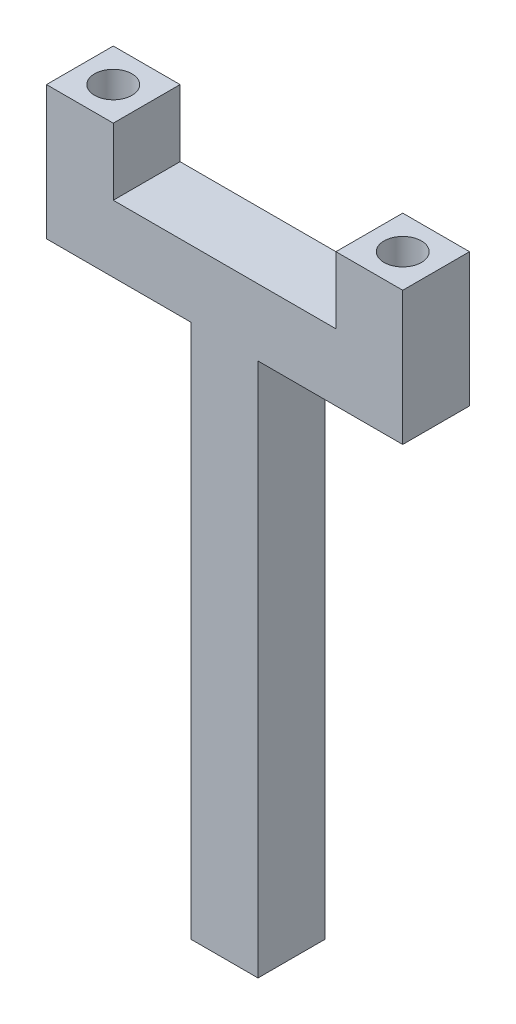
ISO-10303-21;
HEADER;
FILE_DESCRIPTION(('STEP AP214'),'2;1');
FILE_NAME('part.step','',(''),(''),'','','');
FILE_SCHEMA(('AUTOMOTIVE_DESIGN { 1 0 10303 214 1 1 1 1 }'));
ENDSEC;
DATA;
#1=APPLICATION_CONTEXT('core data for automotive mechanical design processes');
#2=APPLICATION_PROTOCOL_DEFINITION('international standard','automotive_design',2000,#1);
#3=PRODUCT_CONTEXT('',#1,'mechanical');
#4=PRODUCT('Part','Part','',(#3));
#5=PRODUCT_RELATED_PRODUCT_CATEGORY('part','',(#4));
#6=PRODUCT_DEFINITION_FORMATION('','',#4);
#7=PRODUCT_DEFINITION_CONTEXT('part definition',#1,'design');
#8=PRODUCT_DEFINITION('design','',#6,#7);
#9=PRODUCT_DEFINITION_SHAPE('','',#8);
#10=(LENGTH_UNIT() NAMED_UNIT(*) SI_UNIT(.MILLI.,.METRE.));
#11=(NAMED_UNIT(*) PLANE_ANGLE_UNIT() SI_UNIT($,.RADIAN.));
#12=(NAMED_UNIT(*) SI_UNIT($,.STERADIAN.) SOLID_ANGLE_UNIT());
#13=UNCERTAINTY_MEASURE_WITH_UNIT(LENGTH_MEASURE(1.E-05),#10,'distance_accuracy_value','');
#14=(GEOMETRIC_REPRESENTATION_CONTEXT(3) GLOBAL_UNCERTAINTY_ASSIGNED_CONTEXT((#13)) GLOBAL_UNIT_ASSIGNED_CONTEXT((#10,
#11,#12)) REPRESENTATION_CONTEXT('',''));
#15=CARTESIAN_POINT('',(0.,0.,0.));
#16=DIRECTION('',(0.,0.,1.));
#17=DIRECTION('',(1.,0.,0.));
#18=AXIS2_PLACEMENT_3D('',#15,#16,#17);
#19=CARTESIAN_POINT('',(12.5,75.,7.5));
#20=DIRECTION('',(1.,0.,0.));
#21=DIRECTION('',(0.,0.,-1.));
#22=AXIS2_PLACEMENT_3D('',#19,#20,#21);
#23=PLANE('',#22);
#24=DIRECTION('',(0.,-1.,0.));
#25=VECTOR('',#24,1.);
#26=CARTESIAN_POINT('',(12.5,75.,0.));
#27=LINE('',#26,#25);
#28=CARTESIAN_POINT('',(12.5,75.,0.));
#29=VERTEX_POINT('',#28);
#30=CARTESIAN_POINT('',(12.5,67.5,0.));
#31=VERTEX_POINT('',#30);
#32=EDGE_CURVE('E153',#29,#31,#27,.T.);
#33=ORIENTED_EDGE('',*,*,#32,.T.);
#34=DIRECTION('',(0.,0.,-1.));
#35=VECTOR('',#34,1.);
#36=CARTESIAN_POINT('',(12.5,67.5,7.5));
#37=LINE('',#36,#35);
#38=CARTESIAN_POINT('',(12.5,67.5,7.5));
#39=VERTEX_POINT('',#38);
#40=EDGE_CURVE('E11',#39,#31,#37,.T.);
#41=ORIENTED_EDGE('',*,*,#40,.F.);
#42=DIRECTION('',(0.,-1.,0.));
#43=VECTOR('',#42,1.);
#44=CARTESIAN_POINT('',(12.5,75.,7.5));
#45=LINE('',#44,#43);
#46=CARTESIAN_POINT('',(12.5,75.,7.5));
#47=VERTEX_POINT('',#46);
#48=EDGE_CURVE('E176',#47,#39,#45,.T.);
#49=ORIENTED_EDGE('',*,*,#48,.F.);
#50=DIRECTION('',(0.,0.,-1.));
#51=VECTOR('',#50,1.);
#52=CARTESIAN_POINT('',(12.5,75.,7.5));
#53=LINE('',#52,#51);
#54=EDGE_CURVE('E149',#47,#29,#53,.T.);
#55=ORIENTED_EDGE('',*,*,#54,.T.);
#56=EDGE_LOOP('',(#33,#41,#49,#55));
#57=FACE_BOUND('',#56,.T.);
#58=ADVANCED_FACE('F33',(#57),#23,.F.);
#59=CARTESIAN_POINT('',(0.,67.5,7.5));
#60=DIRECTION('',(0.,-1.,0.));
#61=DIRECTION('',(0.,0.,-1.));
#62=AXIS2_PLACEMENT_3D('',#59,#60,#61);
#63=PLANE('',#62);
#64=DIRECTION('',(-1.,0.,0.));
#65=VECTOR('',#64,1.);
#66=CARTESIAN_POINT('',(0.,67.5,0.));
#67=LINE('',#66,#65);
#68=CARTESIAN_POINT('',(-12.5,67.5,0.));
#69=VERTEX_POINT('',#68);
#70=EDGE_CURVE('E156',#31,#69,#67,.T.);
#71=ORIENTED_EDGE('',*,*,#70,.T.);
#72=DIRECTION('',(0.,0.,-1.));
#73=VECTOR('',#72,1.);
#74=CARTESIAN_POINT('',(-12.5,67.5,7.5));
#75=LINE('',#74,#73);
#76=CARTESIAN_POINT('',(-12.5,67.5,7.5));
#77=VERTEX_POINT('',#76);
#78=EDGE_CURVE('E41',#77,#69,#75,.T.);
#79=ORIENTED_EDGE('',*,*,#78,.F.);
#80=DIRECTION('',(-1.,0.,0.));
#81=VECTOR('',#80,1.);
#82=CARTESIAN_POINT('',(12.5,67.5,7.5));
#83=LINE('',#82,#81);
#84=EDGE_CURVE('E104',#39,#77,#83,.T.);
#85=ORIENTED_EDGE('',*,*,#84,.F.);
#86=ORIENTED_EDGE('',*,*,#40,.T.);
#87=EDGE_LOOP('',(#71,#79,#85,#86));
#88=FACE_BOUND('',#87,.T.);
#89=ADVANCED_FACE('F256',(#88),#63,.F.);
#90=CARTESIAN_POINT('',(-12.5,67.5,7.5));
#91=DIRECTION('',(-1.,0.,0.));
#92=DIRECTION('',(0.,0.,1.));
#93=AXIS2_PLACEMENT_3D('',#90,#91,#92);
#94=PLANE('',#93);
#95=DIRECTION('',(0.,1.,0.));
#96=VECTOR('',#95,1.);
#97=CARTESIAN_POINT('',(-12.5,67.5,0.));
#98=LINE('',#97,#96);
#99=CARTESIAN_POINT('',(-12.5,75.,0.));
#100=VERTEX_POINT('',#99);
#101=EDGE_CURVE('E159',#69,#100,#98,.T.);
#102=ORIENTED_EDGE('',*,*,#101,.T.);
#103=DIRECTION('',(0.,0.,-1.));
#104=VECTOR('',#103,1.);
#105=CARTESIAN_POINT('',(-12.5,75.,7.5));
#106=LINE('',#105,#104);
#107=CARTESIAN_POINT('',(-12.5,75.,7.5));
#108=VERTEX_POINT('',#107);
#109=EDGE_CURVE('E195',#108,#100,#106,.T.);
#110=ORIENTED_EDGE('',*,*,#109,.F.);
#111=DIRECTION('',(0.,1.,0.));
#112=VECTOR('',#111,1.);
#113=CARTESIAN_POINT('',(-12.5,67.5,7.5));
#114=LINE('',#113,#112);
#115=EDGE_CURVE('E203',#77,#108,#114,.T.);
#116=ORIENTED_EDGE('',*,*,#115,.F.);
#117=ORIENTED_EDGE('',*,*,#78,.T.);
#118=EDGE_LOOP('',(#102,#110,#116,#117));
#119=FACE_BOUND('',#118,.T.);
#120=ADVANCED_FACE('F201',(#119),#94,.F.);
#121=CARTESIAN_POINT('',(-12.5,75.,7.5));
#122=DIRECTION('',(0.,-1.,0.));
#123=DIRECTION('',(0.,0.,-1.));
#124=AXIS2_PLACEMENT_3D('',#121,#122,#123);
#125=PLANE('',#124);
#126=CARTESIAN_POINT('',(-16.25,75.,3.75));
#127=DIRECTION('',(0.,1.,0.));
#128=DIRECTION('',(0.,0.,1.));
#129=AXIS2_PLACEMENT_3D('',#126,#127,#128);
#130=CIRCLE('',#129,2.1);
#131=CARTESIAN_POINT('',(-16.25,75.,5.85));
#132=VERTEX_POINT('',#131);
#133=EDGE_CURVE('E362',#132,#132,#130,.T.);
#134=ORIENTED_EDGE('',*,*,#133,.F.);
#135=EDGE_LOOP('',(#134));
#136=FACE_BOUND('',#135,.T.);
#137=DIRECTION('',(-1.,0.,0.));
#138=VECTOR('',#137,1.);
#139=CARTESIAN_POINT('',(-12.5,75.,0.));
#140=LINE('',#139,#138);
#141=CARTESIAN_POINT('',(-20.,75.,0.));
#142=VERTEX_POINT('',#141);
#143=EDGE_CURVE('E161',#100,#142,#140,.T.);
#144=ORIENTED_EDGE('',*,*,#143,.T.);
#145=DIRECTION('',(0.,0.,-1.));
#146=VECTOR('',#145,1.);
#147=CARTESIAN_POINT('',(-20.,75.,7.5));
#148=LINE('',#147,#146);
#149=CARTESIAN_POINT('',(-20.,75.,7.5));
#150=VERTEX_POINT('',#149);
#151=EDGE_CURVE('E192',#150,#142,#148,.T.);
#152=ORIENTED_EDGE('',*,*,#151,.F.);
#153=DIRECTION('',(-1.,0.,0.));
#154=VECTOR('',#153,1.);
#155=CARTESIAN_POINT('',(-12.5,75.,7.5));
#156=LINE('',#155,#154);
#157=EDGE_CURVE('E221',#108,#150,#156,.T.);
#158=ORIENTED_EDGE('',*,*,#157,.F.);
#159=ORIENTED_EDGE('',*,*,#109,.T.);
#160=EDGE_LOOP('',(#144,#152,#158,#159));
#161=FACE_BOUND('',#160,.T.);
#162=ADVANCED_FACE('F212',(#136,#161),#125,.F.);
#163=CARTESIAN_POINT('',(-20.,75.,7.5));
#164=DIRECTION('',(1.,0.,0.));
#165=DIRECTION('',(0.,0.,-1.));
#166=AXIS2_PLACEMENT_3D('',#163,#164,#165);
#167=PLANE('',#166);
#168=DIRECTION('',(0.,-1.,0.));
#169=VECTOR('',#168,1.);
#170=CARTESIAN_POINT('',(-20.,75.,0.));
#171=LINE('',#170,#169);
#172=CARTESIAN_POINT('',(-20.,60.,0.));
#173=VERTEX_POINT('',#172);
#174=EDGE_CURVE('E163',#142,#173,#171,.T.);
#175=ORIENTED_EDGE('',*,*,#174,.T.);
#176=DIRECTION('',(0.,0.,-1.));
#177=VECTOR('',#176,1.);
#178=CARTESIAN_POINT('',(-20.,60.,7.5));
#179=LINE('',#178,#177);
#180=CARTESIAN_POINT('',(-20.,60.,7.5));
#181=VERTEX_POINT('',#180);
#182=EDGE_CURVE('E189',#181,#173,#179,.T.);
#183=ORIENTED_EDGE('',*,*,#182,.F.);
#184=DIRECTION('',(0.,-1.,0.));
#185=VECTOR('',#184,1.);
#186=CARTESIAN_POINT('',(-20.,75.,7.5));
#187=LINE('',#186,#185);
#188=EDGE_CURVE('E218',#150,#181,#187,.T.);
#189=ORIENTED_EDGE('',*,*,#188,.F.);
#190=ORIENTED_EDGE('',*,*,#151,.T.);
#191=EDGE_LOOP('',(#175,#183,#189,#190));
#192=FACE_BOUND('',#191,.T.);
#193=ADVANCED_FACE('F216',(#192),#167,.F.);
#194=CARTESIAN_POINT('',(-20.,60.,7.5));
#195=DIRECTION('',(0.,1.,0.));
#196=DIRECTION('',(-1.,0.,0.));
#197=AXIS2_PLACEMENT_3D('',#194,#195,#196);
#198=PLANE('',#197);
#199=DIRECTION('',(1.,0.,0.));
#200=VECTOR('',#199,1.);
#201=CARTESIAN_POINT('',(-20.,60.,0.));
#202=LINE('',#201,#200);
#203=CARTESIAN_POINT('',(-3.75,60.,0.));
#204=VERTEX_POINT('',#203);
#205=EDGE_CURVE('E165',#173,#204,#202,.T.);
#206=ORIENTED_EDGE('',*,*,#205,.T.);
#207=DIRECTION('',(0.,0.,-1.));
#208=VECTOR('',#207,1.);
#209=CARTESIAN_POINT('',(-3.75,60.,7.5));
#210=LINE('',#209,#208);
#211=CARTESIAN_POINT('',(-3.75,60.,7.5));
#212=VERTEX_POINT('',#211);
#213=EDGE_CURVE('E186',#212,#204,#210,.T.);
#214=ORIENTED_EDGE('',*,*,#213,.F.);
#215=DIRECTION('',(1.,0.,0.));
#216=VECTOR('',#215,1.);
#217=CARTESIAN_POINT('',(-20.,60.,7.5));
#218=LINE('',#217,#216);
#219=EDGE_CURVE('E220',#181,#212,#218,.T.);
#220=ORIENTED_EDGE('',*,*,#219,.F.);
#221=ORIENTED_EDGE('',*,*,#182,.T.);
#222=EDGE_LOOP('',(#206,#214,#220,#221));
#223=FACE_BOUND('',#222,.T.);
#224=ADVANCED_FACE('F270',(#223),#198,.F.);
#225=CARTESIAN_POINT('',(-3.75,60.,7.5));
#226=DIRECTION('',(1.,0.,0.));
#227=DIRECTION('',(0.,0.,-1.));
#228=AXIS2_PLACEMENT_3D('',#225,#226,#227);
#229=PLANE('',#228);
#230=DIRECTION('',(0.,-1.,0.));
#231=VECTOR('',#230,1.);
#232=CARTESIAN_POINT('',(-3.75,60.,0.));
#233=LINE('',#232,#231);
#234=CARTESIAN_POINT('',(-3.75,0.,0.));
#235=VERTEX_POINT('',#234);
#236=EDGE_CURVE('E167',#204,#235,#233,.T.);
#237=ORIENTED_EDGE('',*,*,#236,.T.);
#238=DIRECTION('',(0.,0.,-1.));
#239=VECTOR('',#238,1.);
#240=CARTESIAN_POINT('',(-3.75,0.,7.5));
#241=LINE('',#240,#239);
#242=CARTESIAN_POINT('',(-3.75,0.,7.5));
#243=VERTEX_POINT('',#242);
#244=EDGE_CURVE('E183',#243,#235,#241,.T.);
#245=ORIENTED_EDGE('',*,*,#244,.F.);
#246=DIRECTION('',(0.,-1.,0.));
#247=VECTOR('',#246,1.);
#248=CARTESIAN_POINT('',(-3.75,60.,7.5));
#249=LINE('',#248,#247);
#250=EDGE_CURVE('E223',#212,#243,#249,.T.);
#251=ORIENTED_EDGE('',*,*,#250,.F.);
#252=ORIENTED_EDGE('',*,*,#213,.T.);
#253=EDGE_LOOP('',(#237,#245,#251,#252));
#254=FACE_BOUND('',#253,.T.);
#255=ADVANCED_FACE('F273',(#254),#229,.F.);
#256=CARTESIAN_POINT('',(3.75,0.,7.5));
#257=DIRECTION('',(0.,1.,0.));
#258=DIRECTION('',(0.,0.,1.));
#259=AXIS2_PLACEMENT_3D('',#256,#257,#258);
#260=PLANE('',#259);
#261=DIRECTION('',(1.,0.,0.));
#262=VECTOR('',#261,1.);
#263=CARTESIAN_POINT('',(3.75,0.,0.));
#264=LINE('',#263,#262);
#265=CARTESIAN_POINT('',(3.75,0.,0.));
#266=VERTEX_POINT('',#265);
#267=EDGE_CURVE('E169',#235,#266,#264,.T.);
#268=ORIENTED_EDGE('',*,*,#267,.T.);
#269=DIRECTION('',(0.,0.,-1.));
#270=VECTOR('',#269,1.);
#271=CARTESIAN_POINT('',(3.75,0.,7.5));
#272=LINE('',#271,#270);
#273=CARTESIAN_POINT('',(3.75,0.,7.5));
#274=VERTEX_POINT('',#273);
#275=EDGE_CURVE('E180',#274,#266,#272,.T.);
#276=ORIENTED_EDGE('',*,*,#275,.F.);
#277=DIRECTION('',(1.,0.,0.));
#278=VECTOR('',#277,1.);
#279=CARTESIAN_POINT('',(3.75,0.,7.5));
#280=LINE('',#279,#278);
#281=EDGE_CURVE('E229',#243,#274,#280,.T.);
#282=ORIENTED_EDGE('',*,*,#281,.F.);
#283=ORIENTED_EDGE('',*,*,#244,.T.);
#284=EDGE_LOOP('',(#268,#276,#282,#283));
#285=FACE_BOUND('',#284,.T.);
#286=ADVANCED_FACE('F235',(#285),#260,.F.);
#287=CARTESIAN_POINT('',(3.75,60.,7.5));
#288=DIRECTION('',(-1.,0.,0.));
#289=DIRECTION('',(0.,0.,1.));
#290=AXIS2_PLACEMENT_3D('',#287,#288,#289);
#291=PLANE('',#290);
#292=DIRECTION('',(0.,1.,0.));
#293=VECTOR('',#292,1.);
#294=CARTESIAN_POINT('',(3.75,60.,0.));
#295=LINE('',#294,#293);
#296=CARTESIAN_POINT('',(3.75,60.,0.));
#297=VERTEX_POINT('',#296);
#298=EDGE_CURVE('E171',#266,#297,#295,.T.);
#299=ORIENTED_EDGE('',*,*,#298,.T.);
#300=DIRECTION('',(0.,0.,-1.));
#301=VECTOR('',#300,1.);
#302=CARTESIAN_POINT('',(3.75,60.,7.5));
#303=LINE('',#302,#301);
#304=CARTESIAN_POINT('',(3.75,60.,7.5));
#305=VERTEX_POINT('',#304);
#306=EDGE_CURVE('E144',#305,#297,#303,.T.);
#307=ORIENTED_EDGE('',*,*,#306,.F.);
#308=DIRECTION('',(0.,1.,0.));
#309=VECTOR('',#308,1.);
#310=CARTESIAN_POINT('',(3.75,60.,7.5));
#311=LINE('',#310,#309);
#312=EDGE_CURVE('E135',#274,#305,#311,.T.);
#313=ORIENTED_EDGE('',*,*,#312,.F.);
#314=ORIENTED_EDGE('',*,*,#275,.T.);
#315=EDGE_LOOP('',(#299,#307,#313,#314));
#316=FACE_BOUND('',#315,.T.);
#317=ADVANCED_FACE('F239',(#316),#291,.F.);
#318=CARTESIAN_POINT('',(20.,60.,7.5));
#319=DIRECTION('',(0.,1.,0.));
#320=DIRECTION('',(-1.,0.,0.));
#321=AXIS2_PLACEMENT_3D('',#318,#319,#320);
#322=PLANE('',#321);
#323=DIRECTION('',(1.,0.,0.));
#324=VECTOR('',#323,1.);
#325=CARTESIAN_POINT('',(20.,60.,0.));
#326=LINE('',#325,#324);
#327=CARTESIAN_POINT('',(20.,60.,0.));
#328=VERTEX_POINT('',#327);
#329=EDGE_CURVE('E143',#297,#328,#326,.T.);
#330=ORIENTED_EDGE('',*,*,#329,.T.);
#331=DIRECTION('',(0.,0.,-1.));
#332=VECTOR('',#331,1.);
#333=CARTESIAN_POINT('',(20.,60.,7.5));
#334=LINE('',#333,#332);
#335=CARTESIAN_POINT('',(20.,60.,7.5));
#336=VERTEX_POINT('',#335);
#337=EDGE_CURVE('E140',#336,#328,#334,.T.);
#338=ORIENTED_EDGE('',*,*,#337,.F.);
#339=DIRECTION('',(1.,0.,0.));
#340=VECTOR('',#339,1.);
#341=CARTESIAN_POINT('',(20.,60.,7.5));
#342=LINE('',#341,#340);
#343=EDGE_CURVE('E129',#305,#336,#342,.T.);
#344=ORIENTED_EDGE('',*,*,#343,.F.);
#345=ORIENTED_EDGE('',*,*,#306,.T.);
#346=EDGE_LOOP('',(#330,#338,#344,#345));
#347=FACE_BOUND('',#346,.T.);
#348=ADVANCED_FACE('F141',(#347),#322,.F.);
#349=CARTESIAN_POINT('',(20.,75.,7.5));
#350=DIRECTION('',(-1.,0.,0.));
#351=DIRECTION('',(0.,-1.,0.));
#352=AXIS2_PLACEMENT_3D('',#349,#350,#351);
#353=PLANE('',#352);
#354=DIRECTION('',(0.,1.,0.));
#355=VECTOR('',#354,1.);
#356=CARTESIAN_POINT('',(20.,75.,0.));
#357=LINE('',#356,#355);
#358=CARTESIAN_POINT('',(20.,75.,0.));
#359=VERTEX_POINT('',#358);
#360=EDGE_CURVE('E90',#328,#359,#357,.T.);
#361=ORIENTED_EDGE('',*,*,#360,.T.);
#362=DIRECTION('',(0.,0.,-1.));
#363=VECTOR('',#362,1.);
#364=CARTESIAN_POINT('',(20.,75.,7.5));
#365=LINE('',#364,#363);
#366=CARTESIAN_POINT('',(20.,75.,7.5));
#367=VERTEX_POINT('',#366);
#368=EDGE_CURVE('E145',#367,#359,#365,.T.);
#369=ORIENTED_EDGE('',*,*,#368,.F.);
#370=DIRECTION('',(0.,1.,0.));
#371=VECTOR('',#370,1.);
#372=CARTESIAN_POINT('',(20.,75.,7.5));
#373=LINE('',#372,#371);
#374=EDGE_CURVE('E133',#336,#367,#373,.T.);
#375=ORIENTED_EDGE('',*,*,#374,.F.);
#376=ORIENTED_EDGE('',*,*,#337,.T.);
#377=EDGE_LOOP('',(#361,#369,#375,#376));
#378=FACE_BOUND('',#377,.T.);
#379=ADVANCED_FACE('F147',(#378),#353,.F.);
#380=CARTESIAN_POINT('',(12.5,75.,7.5));
#381=DIRECTION('',(0.,-1.,0.));
#382=DIRECTION('',(0.,0.,-1.));
#383=AXIS2_PLACEMENT_3D('',#380,#381,#382);
#384=PLANE('',#383);
#385=CARTESIAN_POINT('',(16.25,75.,3.75));
#386=DIRECTION('',(0.,1.,0.));
#387=DIRECTION('',(0.,0.,1.));
#388=AXIS2_PLACEMENT_3D('',#385,#386,#387);
#389=CIRCLE('',#388,2.1);
#390=CARTESIAN_POINT('',(16.25,75.,5.85));
#391=VERTEX_POINT('',#390);
#392=EDGE_CURVE('E370',#391,#391,#389,.T.);
#393=ORIENTED_EDGE('',*,*,#392,.F.);
#394=EDGE_LOOP('',(#393));
#395=FACE_BOUND('',#394,.T.);
#396=DIRECTION('',(-1.,0.,0.));
#397=VECTOR('',#396,1.);
#398=CARTESIAN_POINT('',(12.5,75.,0.));
#399=LINE('',#398,#397);
#400=EDGE_CURVE('E96',#359,#29,#399,.T.);
#401=ORIENTED_EDGE('',*,*,#400,.T.);
#402=ORIENTED_EDGE('',*,*,#54,.F.);
#403=DIRECTION('',(-1.,0.,0.));
#404=VECTOR('',#403,1.);
#405=CARTESIAN_POINT('',(12.5,75.,7.5));
#406=LINE('',#405,#404);
#407=EDGE_CURVE('E49',#367,#47,#406,.T.);
#408=ORIENTED_EDGE('',*,*,#407,.F.);
#409=ORIENTED_EDGE('',*,*,#368,.T.);
#410=EDGE_LOOP('',(#401,#402,#408,#409));
#411=FACE_BOUND('',#410,.T.);
#412=ADVANCED_FACE('F243',(#395,#411),#384,.F.);
#413=CARTESIAN_POINT('',(0.,0.,7.5));
#414=DIRECTION('',(0.,0.,-1.));
#415=DIRECTION('',(-1.,0.,0.));
#416=AXIS2_PLACEMENT_3D('',#413,#414,#415);
#417=PLANE('',#416);
#418=ORIENTED_EDGE('',*,*,#48,.T.);
#419=ORIENTED_EDGE('',*,*,#84,.T.);
#420=ORIENTED_EDGE('',*,*,#115,.T.);
#421=ORIENTED_EDGE('',*,*,#157,.T.);
#422=ORIENTED_EDGE('',*,*,#188,.T.);
#423=ORIENTED_EDGE('',*,*,#219,.T.);
#424=ORIENTED_EDGE('',*,*,#250,.T.);
#425=ORIENTED_EDGE('',*,*,#281,.T.);
#426=ORIENTED_EDGE('',*,*,#312,.T.);
#427=ORIENTED_EDGE('',*,*,#343,.T.);
#428=ORIENTED_EDGE('',*,*,#374,.T.);
#429=ORIENTED_EDGE('',*,*,#407,.T.);
#430=EDGE_LOOP('',(#418,#419,#420,#421,#422,#423,#424,#425,#426,#427,#428,#429));
#431=FACE_BOUND('',#430,.T.);
#432=ADVANCED_FACE('F131',(#431),#417,.F.);
#433=CARTESIAN_POINT('',(0.,0.,0.));
#434=DIRECTION('',(0.,0.,-1.));
#435=DIRECTION('',(-1.,0.,0.));
#436=AXIS2_PLACEMENT_3D('',#433,#434,#435);
#437=PLANE('',#436);
#438=ORIENTED_EDGE('',*,*,#32,.F.);
#439=ORIENTED_EDGE('',*,*,#400,.F.);
#440=ORIENTED_EDGE('',*,*,#360,.F.);
#441=ORIENTED_EDGE('',*,*,#329,.F.);
#442=ORIENTED_EDGE('',*,*,#298,.F.);
#443=ORIENTED_EDGE('',*,*,#267,.F.);
#444=ORIENTED_EDGE('',*,*,#236,.F.);
#445=ORIENTED_EDGE('',*,*,#205,.F.);
#446=ORIENTED_EDGE('',*,*,#174,.F.);
#447=ORIENTED_EDGE('',*,*,#143,.F.);
#448=ORIENTED_EDGE('',*,*,#101,.F.);
#449=ORIENTED_EDGE('',*,*,#70,.F.);
#450=EDGE_LOOP('',(#438,#439,#440,#441,#442,#443,#444,#445,#446,#447,#448,#449));
#451=FACE_BOUND('',#450,.T.);
#452=ADVANCED_FACE('F207',(#451),#437,.T.);
#453=CARTESIAN_POINT('',(16.25,70.,3.75));
#454=DIRECTION('',(0.,1.,0.));
#455=DIRECTION('',(0.,0.,1.));
#456=AXIS2_PLACEMENT_3D('',#453,#454,#455);
#457=CYLINDRICAL_SURFACE('',#456,2.1);
#458=CARTESIAN_POINT('',(16.25,70.,3.75));
#459=DIRECTION('',(0.,1.,0.));
#460=DIRECTION('',(0.,0.,1.));
#461=AXIS2_PLACEMENT_3D('',#458,#459,#460);
#462=CIRCLE('',#461,2.1);
#463=CARTESIAN_POINT('',(16.25,70.,5.85));
#464=VERTEX_POINT('',#463);
#465=EDGE_CURVE('E365',#464,#464,#462,.T.);
#466=ORIENTED_EDGE('',*,*,#465,.F.);
#467=EDGE_LOOP('',(#466));
#468=FACE_BOUND('',#467,.T.);
#469=ORIENTED_EDGE('',*,*,#392,.T.);
#470=EDGE_LOOP('',(#469));
#471=FACE_BOUND('',#470,.T.);
#472=ADVANCED_FACE('F307',(#468,#471),#457,.F.);
#473=CARTESIAN_POINT('',(16.25,70.,3.75));
#474=DIRECTION('',(0.,1.,0.));
#475=DIRECTION('',(0.,0.,1.));
#476=AXIS2_PLACEMENT_3D('',#473,#474,#475);
#477=PLANE('',#476);
#478=ORIENTED_EDGE('',*,*,#465,.T.);
#479=EDGE_LOOP('',(#478));
#480=FACE_BOUND('',#479,.T.);
#481=ADVANCED_FACE('F326',(#480),#477,.T.);
#482=CARTESIAN_POINT('',(-16.25,70.,3.75));
#483=DIRECTION('',(0.,1.,0.));
#484=DIRECTION('',(0.,0.,1.));
#485=AXIS2_PLACEMENT_3D('',#482,#483,#484);
#486=CYLINDRICAL_SURFACE('',#485,2.1);
#487=CARTESIAN_POINT('',(-16.25,70.,3.75));
#488=DIRECTION('',(0.,1.,0.));
#489=DIRECTION('',(0.,0.,1.));
#490=AXIS2_PLACEMENT_3D('',#487,#488,#489);
#491=CIRCLE('',#490,2.1);
#492=CARTESIAN_POINT('',(-16.25,70.,5.85));
#493=VERTEX_POINT('',#492);
#494=EDGE_CURVE('E157',#493,#493,#491,.T.);
#495=ORIENTED_EDGE('',*,*,#494,.F.);
#496=EDGE_LOOP('',(#495));
#497=FACE_BOUND('',#496,.T.);
#498=ORIENTED_EDGE('',*,*,#133,.T.);
#499=EDGE_LOOP('',(#498));
#500=FACE_BOUND('',#499,.T.);
#501=ADVANCED_FACE('F336',(#497,#500),#486,.F.);
#502=CARTESIAN_POINT('',(-16.25,70.,3.75));
#503=DIRECTION('',(0.,1.,0.));
#504=DIRECTION('',(0.,0.,1.));
#505=AXIS2_PLACEMENT_3D('',#502,#503,#504);
#506=PLANE('',#505);
#507=ORIENTED_EDGE('',*,*,#494,.T.);
#508=EDGE_LOOP('',(#507));
#509=FACE_BOUND('',#508,.T.);
#510=ADVANCED_FACE('F346',(#509),#506,.T.);
#511=CLOSED_SHELL('',(#58,#89,#120,#162,#193,#224,#255,#286,#317,#348,#379,#412,#432,#452,#472,
#481,#501,#510));
#512=MANIFOLD_SOLID_BREP('B2',#511);
#513=ADVANCED_BREP_SHAPE_REPRESENTATION('',(#18,#512),#14);
#514=SHAPE_DEFINITION_REPRESENTATION(#9,#513);
ENDSEC;
END-ISO-10303-21;
